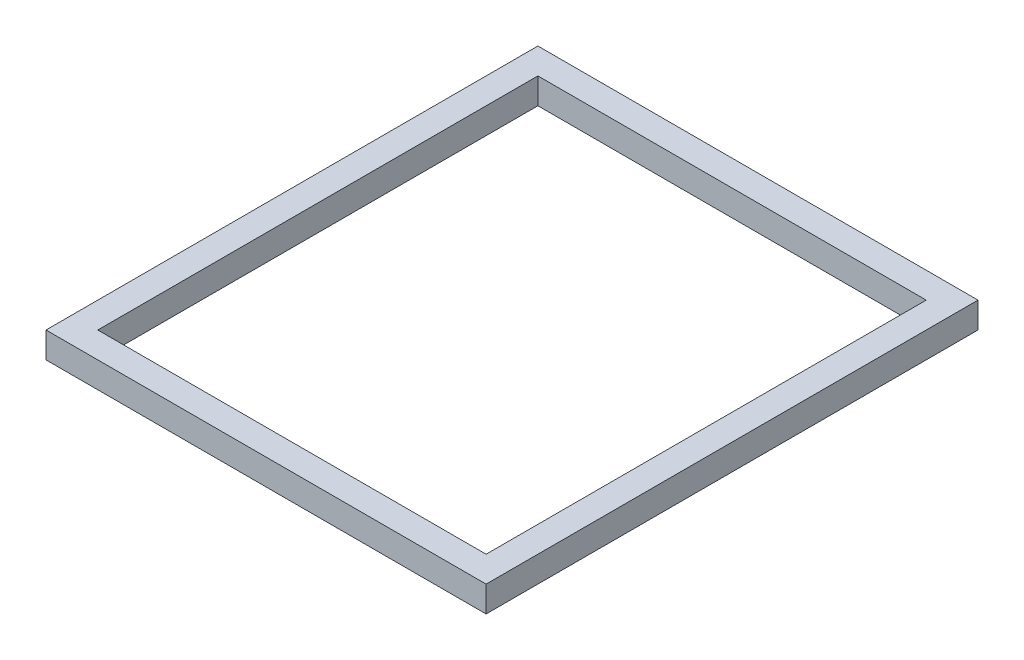
ISO-10303-21;
HEADER;
FILE_DESCRIPTION(('STEP AP214'),'2;1');
FILE_NAME('part.step','',(''),(''),'','','');
FILE_SCHEMA(('AUTOMOTIVE_DESIGN { 1 0 10303 214 1 1 1 1 }'));
ENDSEC;
DATA;
#1=APPLICATION_CONTEXT('core data for automotive mechanical design processes');
#2=APPLICATION_PROTOCOL_DEFINITION('international standard','automotive_design',2000,#1);
#3=PRODUCT_CONTEXT('',#1,'mechanical');
#4=PRODUCT('Part','Part','',(#3));
#5=PRODUCT_RELATED_PRODUCT_CATEGORY('part','',(#4));
#6=PRODUCT_DEFINITION_FORMATION('','',#4);
#7=PRODUCT_DEFINITION_CONTEXT('part definition',#1,'design');
#8=PRODUCT_DEFINITION('design','',#6,#7);
#9=PRODUCT_DEFINITION_SHAPE('','',#8);
#10=(LENGTH_UNIT() NAMED_UNIT(*) SI_UNIT(.MILLI.,.METRE.));
#11=(NAMED_UNIT(*) PLANE_ANGLE_UNIT() SI_UNIT($,.RADIAN.));
#12=(NAMED_UNIT(*) SI_UNIT($,.STERADIAN.) SOLID_ANGLE_UNIT());
#13=UNCERTAINTY_MEASURE_WITH_UNIT(LENGTH_MEASURE(1.E-05),#10,'distance_accuracy_value','');
#14=(GEOMETRIC_REPRESENTATION_CONTEXT(3) GLOBAL_UNCERTAINTY_ASSIGNED_CONTEXT((#13)) GLOBAL_UNIT_ASSIGNED_CONTEXT((#10,
#11,#12)) REPRESENTATION_CONTEXT('',''));
#15=CARTESIAN_POINT('',(0.,0.,0.));
#16=DIRECTION('',(0.,0.,1.));
#17=DIRECTION('',(1.,0.,0.));
#18=AXIS2_PLACEMENT_3D('',#15,#16,#17);
#19=CARTESIAN_POINT('',(0.,6.35,0.));
#20=DIRECTION('',(0.,-1.,0.));
#21=DIRECTION('',(0.,0.,-1.));
#22=AXIS2_PLACEMENT_3D('',#19,#20,#21);
#23=PLANE('',#22);
#24=DIRECTION('',(0.,0.,-1.));
#25=VECTOR('',#24,1.);
#26=CARTESIAN_POINT('',(53.975,6.35,60.325));
#27=LINE('',#26,#25);
#28=CARTESIAN_POINT('',(53.975,6.35,60.325));
#29=VERTEX_POINT('',#28);
#30=CARTESIAN_POINT('',(53.975,6.35,-60.325));
#31=VERTEX_POINT('',#30);
#32=EDGE_CURVE('E134',#29,#31,#27,.T.);
#33=ORIENTED_EDGE('',*,*,#32,.T.);
#34=DIRECTION('',(-1.,0.,0.));
#35=VECTOR('',#34,1.);
#36=CARTESIAN_POINT('',(-53.975,6.35,-60.325));
#37=LINE('',#36,#35);
#38=CARTESIAN_POINT('',(-53.975,6.35,-60.325));
#39=VERTEX_POINT('',#38);
#40=EDGE_CURVE('E137',#31,#39,#37,.T.);
#41=ORIENTED_EDGE('',*,*,#40,.T.);
#42=DIRECTION('',(0.,0.,1.));
#43=VECTOR('',#42,1.);
#44=CARTESIAN_POINT('',(-53.975,6.35,60.325));
#45=LINE('',#44,#43);
#46=CARTESIAN_POINT('',(-53.975,6.35,60.325));
#47=VERTEX_POINT('',#46);
#48=EDGE_CURVE('E140',#39,#47,#45,.T.);
#49=ORIENTED_EDGE('',*,*,#48,.T.);
#50=DIRECTION('',(1.,0.,0.));
#51=VECTOR('',#50,1.);
#52=CARTESIAN_POINT('',(-53.975,6.35,60.325));
#53=LINE('',#52,#51);
#54=EDGE_CURVE('E142',#47,#29,#53,.T.);
#55=ORIENTED_EDGE('',*,*,#54,.T.);
#56=EDGE_LOOP('',(#33,#41,#49,#55));
#57=FACE_BOUND('',#56,.T.);
#58=DIRECTION('',(0.,0.,-1.));
#59=VECTOR('',#58,1.);
#60=CARTESIAN_POINT('',(47.625,6.35,53.975));
#61=LINE('',#60,#59);
#62=CARTESIAN_POINT('',(47.625,6.35,53.975));
#63=VERTEX_POINT('',#62);
#64=CARTESIAN_POINT('',(47.625,6.35,-53.975));
#65=VERTEX_POINT('',#64);
#66=EDGE_CURVE('E98',#63,#65,#61,.T.);
#67=ORIENTED_EDGE('',*,*,#66,.F.);
#68=DIRECTION('',(1.,0.,0.));
#69=VECTOR('',#68,1.);
#70=CARTESIAN_POINT('',(-47.625,6.35,53.975));
#71=LINE('',#70,#69);
#72=CARTESIAN_POINT('',(-47.625,6.35,53.975));
#73=VERTEX_POINT('',#72);
#74=EDGE_CURVE('E120',#73,#63,#71,.T.);
#75=ORIENTED_EDGE('',*,*,#74,.F.);
#76=DIRECTION('',(0.,0.,1.));
#77=VECTOR('',#76,1.);
#78=CARTESIAN_POINT('',(-47.625,6.35,53.975));
#79=LINE('',#78,#77);
#80=CARTESIAN_POINT('',(-47.625,6.35,-53.975));
#81=VERTEX_POINT('',#80);
#82=EDGE_CURVE('E118',#81,#73,#79,.T.);
#83=ORIENTED_EDGE('',*,*,#82,.F.);
#84=DIRECTION('',(-1.,0.,0.));
#85=VECTOR('',#84,1.);
#86=CARTESIAN_POINT('',(-47.625,6.35,-53.975));
#87=LINE('',#86,#85);
#88=EDGE_CURVE('E106',#65,#81,#87,.T.);
#89=ORIENTED_EDGE('',*,*,#88,.F.);
#90=EDGE_LOOP('',(#67,#75,#83,#89));
#91=FACE_BOUND('',#90,.T.);
#92=ADVANCED_FACE('F33',(#57,#91),#23,.F.);
#93=CARTESIAN_POINT('',(0.,0.,0.));
#94=DIRECTION('',(0.,-1.,0.));
#95=DIRECTION('',(0.,0.,-1.));
#96=AXIS2_PLACEMENT_3D('',#93,#94,#95);
#97=PLANE('',#96);
#98=DIRECTION('',(0.,0.,-1.));
#99=VECTOR('',#98,1.);
#100=CARTESIAN_POINT('',(53.975,0.,60.325));
#101=LINE('',#100,#99);
#102=CARTESIAN_POINT('',(53.975,0.,60.325));
#103=VERTEX_POINT('',#102);
#104=CARTESIAN_POINT('',(53.975,0.,-60.325));
#105=VERTEX_POINT('',#104);
#106=EDGE_CURVE('E114',#103,#105,#101,.T.);
#107=ORIENTED_EDGE('',*,*,#106,.F.);
#108=DIRECTION('',(1.,0.,0.));
#109=VECTOR('',#108,1.);
#110=CARTESIAN_POINT('',(-53.975,0.,60.325));
#111=LINE('',#110,#109);
#112=CARTESIAN_POINT('',(-53.975,0.,60.325));
#113=VERTEX_POINT('',#112);
#114=EDGE_CURVE('E138',#113,#103,#111,.T.);
#115=ORIENTED_EDGE('',*,*,#114,.F.);
#116=DIRECTION('',(0.,0.,1.));
#117=VECTOR('',#116,1.);
#118=CARTESIAN_POINT('',(-53.975,0.,60.325));
#119=LINE('',#118,#117);
#120=CARTESIAN_POINT('',(-53.975,0.,-60.325));
#121=VERTEX_POINT('',#120);
#122=EDGE_CURVE('E149',#121,#113,#119,.T.);
#123=ORIENTED_EDGE('',*,*,#122,.F.);
#124=DIRECTION('',(-1.,0.,0.));
#125=VECTOR('',#124,1.);
#126=CARTESIAN_POINT('',(-53.975,0.,-60.325));
#127=LINE('',#126,#125);
#128=EDGE_CURVE('E147',#105,#121,#127,.T.);
#129=ORIENTED_EDGE('',*,*,#128,.F.);
#130=EDGE_LOOP('',(#107,#115,#123,#129));
#131=FACE_BOUND('',#130,.T.);
#132=DIRECTION('',(1.,0.,0.));
#133=VECTOR('',#132,1.);
#134=CARTESIAN_POINT('',(-47.625,0.,53.975));
#135=LINE('',#134,#133);
#136=CARTESIAN_POINT('',(-47.625,0.,53.975));
#137=VERTEX_POINT('',#136);
#138=CARTESIAN_POINT('',(47.625,0.,53.975));
#139=VERTEX_POINT('',#138);
#140=EDGE_CURVE('E107',#137,#139,#135,.T.);
#141=ORIENTED_EDGE('',*,*,#140,.T.);
#142=DIRECTION('',(0.,0.,-1.));
#143=VECTOR('',#142,1.);
#144=CARTESIAN_POINT('',(47.625,0.,53.975));
#145=LINE('',#144,#143);
#146=CARTESIAN_POINT('',(47.625,0.,-53.975));
#147=VERTEX_POINT('',#146);
#148=EDGE_CURVE('E56',#139,#147,#145,.T.);
#149=ORIENTED_EDGE('',*,*,#148,.T.);
#150=DIRECTION('',(-1.,0.,0.));
#151=VECTOR('',#150,1.);
#152=CARTESIAN_POINT('',(-47.625,0.,-53.975));
#153=LINE('',#152,#151);
#154=CARTESIAN_POINT('',(-47.625,0.,-53.975));
#155=VERTEX_POINT('',#154);
#156=EDGE_CURVE('E113',#147,#155,#153,.T.);
#157=ORIENTED_EDGE('',*,*,#156,.T.);
#158=DIRECTION('',(0.,0.,1.));
#159=VECTOR('',#158,1.);
#160=CARTESIAN_POINT('',(-47.625,0.,53.975));
#161=LINE('',#160,#159);
#162=EDGE_CURVE('E126',#155,#137,#161,.T.);
#163=ORIENTED_EDGE('',*,*,#162,.T.);
#164=EDGE_LOOP('',(#141,#149,#157,#163));
#165=FACE_BOUND('',#164,.T.);
#166=ADVANCED_FACE('F167',(#131,#165),#97,.T.);
#167=CARTESIAN_POINT('',(53.975,6.35,60.325));
#168=DIRECTION('',(-1.,0.,0.));
#169=DIRECTION('',(0.,0.,1.));
#170=AXIS2_PLACEMENT_3D('',#167,#168,#169);
#171=PLANE('',#170);
#172=ORIENTED_EDGE('',*,*,#106,.T.);
#173=DIRECTION('',(0.,-1.,0.));
#174=VECTOR('',#173,1.);
#175=CARTESIAN_POINT('',(53.975,6.35,-60.325));
#176=LINE('',#175,#174);
#177=EDGE_CURVE('E11',#31,#105,#176,.T.);
#178=ORIENTED_EDGE('',*,*,#177,.F.);
#179=ORIENTED_EDGE('',*,*,#32,.F.);
#180=DIRECTION('',(0.,-1.,0.));
#181=VECTOR('',#180,1.);
#182=CARTESIAN_POINT('',(53.975,6.35,60.325));
#183=LINE('',#182,#181);
#184=EDGE_CURVE('E144',#29,#103,#183,.T.);
#185=ORIENTED_EDGE('',*,*,#184,.T.);
#186=EDGE_LOOP('',(#172,#178,#179,#185));
#187=FACE_BOUND('',#186,.T.);
#188=ADVANCED_FACE('F35',(#187),#171,.F.);
#189=CARTESIAN_POINT('',(-53.975,6.35,-60.325));
#190=DIRECTION('',(0.,0.,1.));
#191=DIRECTION('',(1.,0.,0.));
#192=AXIS2_PLACEMENT_3D('',#189,#190,#191);
#193=PLANE('',#192);
#194=ORIENTED_EDGE('',*,*,#128,.T.);
#195=DIRECTION('',(0.,-1.,0.));
#196=VECTOR('',#195,1.);
#197=CARTESIAN_POINT('',(-53.975,6.35,-60.325));
#198=LINE('',#197,#196);
#199=EDGE_CURVE('E41',#39,#121,#198,.T.);
#200=ORIENTED_EDGE('',*,*,#199,.F.);
#201=ORIENTED_EDGE('',*,*,#40,.F.);
#202=ORIENTED_EDGE('',*,*,#177,.T.);
#203=EDGE_LOOP('',(#194,#200,#201,#202));
#204=FACE_BOUND('',#203,.T.);
#205=ADVANCED_FACE('F177',(#204),#193,.F.);
#206=CARTESIAN_POINT('',(-53.975,6.35,60.325));
#207=DIRECTION('',(1.,0.,0.));
#208=DIRECTION('',(0.,0.,-1.));
#209=AXIS2_PLACEMENT_3D('',#206,#207,#208);
#210=PLANE('',#209);
#211=ORIENTED_EDGE('',*,*,#122,.T.);
#212=DIRECTION('',(0.,-1.,0.));
#213=VECTOR('',#212,1.);
#214=CARTESIAN_POINT('',(-53.975,6.35,60.325));
#215=LINE('',#214,#213);
#216=EDGE_CURVE('E154',#47,#113,#215,.T.);
#217=ORIENTED_EDGE('',*,*,#216,.F.);
#218=ORIENTED_EDGE('',*,*,#48,.F.);
#219=ORIENTED_EDGE('',*,*,#199,.T.);
#220=EDGE_LOOP('',(#211,#217,#218,#219));
#221=FACE_BOUND('',#220,.T.);
#222=ADVANCED_FACE('F161',(#221),#210,.F.);
#223=CARTESIAN_POINT('',(-53.975,6.35,60.325));
#224=DIRECTION('',(0.,0.,-1.));
#225=DIRECTION('',(-1.,0.,0.));
#226=AXIS2_PLACEMENT_3D('',#223,#224,#225);
#227=PLANE('',#226);
#228=ORIENTED_EDGE('',*,*,#114,.T.);
#229=ORIENTED_EDGE('',*,*,#184,.F.);
#230=ORIENTED_EDGE('',*,*,#54,.F.);
#231=ORIENTED_EDGE('',*,*,#216,.T.);
#232=EDGE_LOOP('',(#228,#229,#230,#231));
#233=FACE_BOUND('',#232,.T.);
#234=ADVANCED_FACE('F171',(#233),#227,.F.);
#235=CARTESIAN_POINT('',(47.625,6.35,53.975));
#236=DIRECTION('',(-1.,0.,0.));
#237=DIRECTION('',(0.,0.,1.));
#238=AXIS2_PLACEMENT_3D('',#235,#236,#237);
#239=PLANE('',#238);
#240=ORIENTED_EDGE('',*,*,#148,.F.);
#241=DIRECTION('',(0.,-1.,0.));
#242=VECTOR('',#241,1.);
#243=CARTESIAN_POINT('',(47.625,6.35,53.975));
#244=LINE('',#243,#242);
#245=EDGE_CURVE('E102',#63,#139,#244,.T.);
#246=ORIENTED_EDGE('',*,*,#245,.F.);
#247=ORIENTED_EDGE('',*,*,#66,.T.);
#248=DIRECTION('',(0.,-1.,0.));
#249=VECTOR('',#248,1.);
#250=CARTESIAN_POINT('',(47.625,6.35,-53.975));
#251=LINE('',#250,#249);
#252=EDGE_CURVE('E101',#65,#147,#251,.T.);
#253=ORIENTED_EDGE('',*,*,#252,.T.);
#254=EDGE_LOOP('',(#240,#246,#247,#253));
#255=FACE_BOUND('',#254,.T.);
#256=ADVANCED_FACE('F100',(#255),#239,.T.);
#257=CARTESIAN_POINT('',(-47.625,6.35,-53.975));
#258=DIRECTION('',(0.,0.,1.));
#259=DIRECTION('',(1.,0.,0.));
#260=AXIS2_PLACEMENT_3D('',#257,#258,#259);
#261=PLANE('',#260);
#262=ORIENTED_EDGE('',*,*,#156,.F.);
#263=ORIENTED_EDGE('',*,*,#252,.F.);
#264=ORIENTED_EDGE('',*,*,#88,.T.);
#265=DIRECTION('',(0.,-1.,0.));
#266=VECTOR('',#265,1.);
#267=CARTESIAN_POINT('',(-47.625,6.35,-53.975));
#268=LINE('',#267,#266);
#269=EDGE_CURVE('E115',#81,#155,#268,.T.);
#270=ORIENTED_EDGE('',*,*,#269,.T.);
#271=EDGE_LOOP('',(#262,#263,#264,#270));
#272=FACE_BOUND('',#271,.T.);
#273=ADVANCED_FACE('F110',(#272),#261,.T.);
#274=CARTESIAN_POINT('',(-47.625,6.35,53.975));
#275=DIRECTION('',(1.,0.,0.));
#276=DIRECTION('',(0.,0.,-1.));
#277=AXIS2_PLACEMENT_3D('',#274,#275,#276);
#278=PLANE('',#277);
#279=ORIENTED_EDGE('',*,*,#162,.F.);
#280=ORIENTED_EDGE('',*,*,#269,.F.);
#281=ORIENTED_EDGE('',*,*,#82,.T.);
#282=DIRECTION('',(0.,-1.,0.));
#283=VECTOR('',#282,1.);
#284=CARTESIAN_POINT('',(-47.625,6.35,53.975));
#285=LINE('',#284,#283);
#286=EDGE_CURVE('E48',#73,#137,#285,.T.);
#287=ORIENTED_EDGE('',*,*,#286,.T.);
#288=EDGE_LOOP('',(#279,#280,#281,#287));
#289=FACE_BOUND('',#288,.T.);
#290=ADVANCED_FACE('F200',(#289),#278,.T.);
#291=CARTESIAN_POINT('',(-47.625,6.35,53.975));
#292=DIRECTION('',(0.,0.,-1.));
#293=DIRECTION('',(-1.,0.,0.));
#294=AXIS2_PLACEMENT_3D('',#291,#292,#293);
#295=PLANE('',#294);
#296=ORIENTED_EDGE('',*,*,#140,.F.);
#297=ORIENTED_EDGE('',*,*,#286,.F.);
#298=ORIENTED_EDGE('',*,*,#74,.T.);
#299=ORIENTED_EDGE('',*,*,#245,.T.);
#300=EDGE_LOOP('',(#296,#297,#298,#299));
#301=FACE_BOUND('',#300,.T.);
#302=ADVANCED_FACE('F204',(#301),#295,.T.);
#303=CLOSED_SHELL('',(#92,#166,#188,#205,#222,#234,#256,#273,#290,#302));
#304=MANIFOLD_SOLID_BREP('B2',#303);
#305=ADVANCED_BREP_SHAPE_REPRESENTATION('',(#18,#304),#14);
#306=SHAPE_DEFINITION_REPRESENTATION(#9,#305);
ENDSEC;
END-ISO-10303-21;
